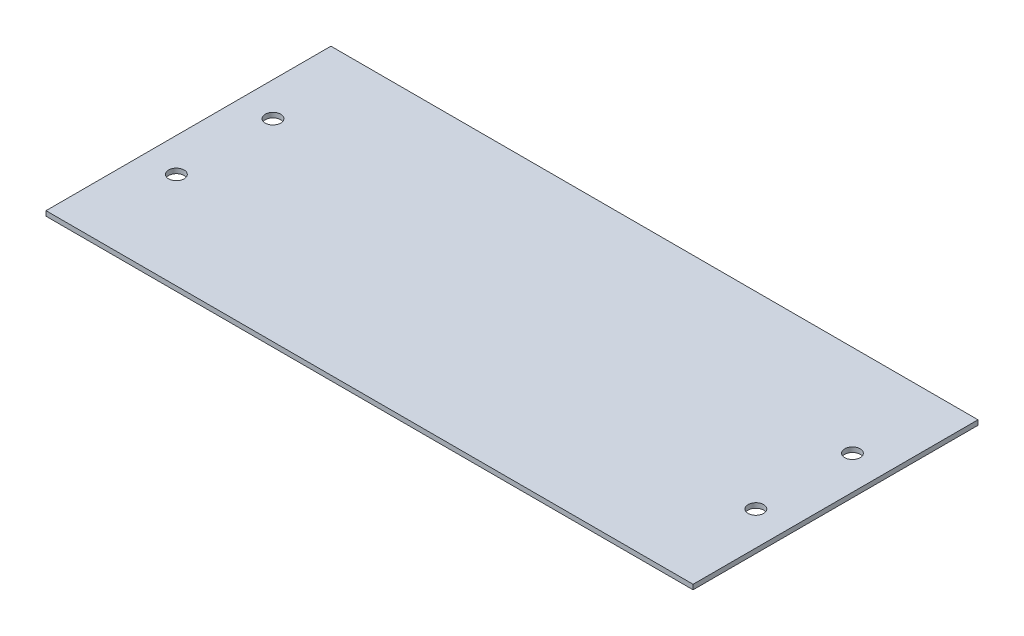
ISO-10303-21;
HEADER;
FILE_DESCRIPTION(('STEP AP214'),'2;1');
FILE_NAME('part.step','',(''),(''),'','','');
FILE_SCHEMA(('AUTOMOTIVE_DESIGN { 1 0 10303 214 1 1 1 1 }'));
ENDSEC;
DATA;
#1=APPLICATION_CONTEXT('core data for automotive mechanical design processes');
#2=APPLICATION_PROTOCOL_DEFINITION('international standard','automotive_design',2000,#1);
#3=PRODUCT_CONTEXT('',#1,'mechanical');
#4=PRODUCT('Part','Part','',(#3));
#5=PRODUCT_RELATED_PRODUCT_CATEGORY('part','',(#4));
#6=PRODUCT_DEFINITION_FORMATION('','',#4);
#7=PRODUCT_DEFINITION_CONTEXT('part definition',#1,'design');
#8=PRODUCT_DEFINITION('design','',#6,#7);
#9=PRODUCT_DEFINITION_SHAPE('','',#8);
#10=(LENGTH_UNIT() NAMED_UNIT(*) SI_UNIT(.MILLI.,.METRE.));
#11=(NAMED_UNIT(*) PLANE_ANGLE_UNIT() SI_UNIT($,.RADIAN.));
#12=(NAMED_UNIT(*) SI_UNIT($,.STERADIAN.) SOLID_ANGLE_UNIT());
#13=UNCERTAINTY_MEASURE_WITH_UNIT(LENGTH_MEASURE(1.E-05),#10,'distance_accuracy_value','');
#14=(GEOMETRIC_REPRESENTATION_CONTEXT(3) GLOBAL_UNCERTAINTY_ASSIGNED_CONTEXT((#13)) GLOBAL_UNIT_ASSIGNED_CONTEXT((#10,
#11,#12)) REPRESENTATION_CONTEXT('',''));
#15=CARTESIAN_POINT('',(0.,0.,0.));
#16=DIRECTION('',(0.,0.,1.));
#17=DIRECTION('',(1.,0.,0.));
#18=AXIS2_PLACEMENT_3D('',#15,#16,#17);
#19=CARTESIAN_POINT('',(-67.,1.,29.5));
#20=DIRECTION('',(1.,0.,0.));
#21=DIRECTION('',(0.,0.,-1.));
#22=AXIS2_PLACEMENT_3D('',#19,#20,#21);
#23=PLANE('',#22);
#24=DIRECTION('',(0.,0.,1.));
#25=VECTOR('',#24,1.);
#26=CARTESIAN_POINT('',(-67.,0.,29.5));
#27=LINE('',#26,#25);
#28=CARTESIAN_POINT('',(-67.,0.,-29.5));
#29=VERTEX_POINT('',#28);
#30=CARTESIAN_POINT('',(-67.,0.,29.5));
#31=VERTEX_POINT('',#30);
#32=EDGE_CURVE('E97',#29,#31,#27,.T.);
#33=ORIENTED_EDGE('',*,*,#32,.T.);
#34=DIRECTION('',(0.,-1.,0.));
#35=VECTOR('',#34,1.);
#36=CARTESIAN_POINT('',(-67.,1.,29.5));
#37=LINE('',#36,#35);
#38=CARTESIAN_POINT('',(-67.,1.,29.5));
#39=VERTEX_POINT('',#38);
#40=EDGE_CURVE('E11',#39,#31,#37,.T.);
#41=ORIENTED_EDGE('',*,*,#40,.F.);
#42=DIRECTION('',(0.,0.,1.));
#43=VECTOR('',#42,1.);
#44=CARTESIAN_POINT('',(-67.,1.,29.5));
#45=LINE('',#44,#43);
#46=CARTESIAN_POINT('',(-67.,1.,-29.5));
#47=VERTEX_POINT('',#46);
#48=EDGE_CURVE('E85',#47,#39,#45,.T.);
#49=ORIENTED_EDGE('',*,*,#48,.F.);
#50=DIRECTION('',(0.,-1.,0.));
#51=VECTOR('',#50,1.);
#52=CARTESIAN_POINT('',(-67.,1.,-29.5));
#53=LINE('',#52,#51);
#54=EDGE_CURVE('E93',#47,#29,#53,.T.);
#55=ORIENTED_EDGE('',*,*,#54,.T.);
#56=EDGE_LOOP('',(#33,#41,#49,#55));
#57=FACE_BOUND('',#56,.T.);
#58=ADVANCED_FACE('F34',(#57),#23,.F.);
#59=CARTESIAN_POINT('',(67.,1.,29.5));
#60=DIRECTION('',(0.,0.,-1.));
#61=DIRECTION('',(-1.,0.,0.));
#62=AXIS2_PLACEMENT_3D('',#59,#60,#61);
#63=PLANE('',#62);
#64=DIRECTION('',(1.,0.,0.));
#65=VECTOR('',#64,1.);
#66=CARTESIAN_POINT('',(67.,0.,29.5));
#67=LINE('',#66,#65);
#68=CARTESIAN_POINT('',(67.,0.,29.5));
#69=VERTEX_POINT('',#68);
#70=EDGE_CURVE('E89',#31,#69,#67,.T.);
#71=ORIENTED_EDGE('',*,*,#70,.T.);
#72=DIRECTION('',(0.,-1.,0.));
#73=VECTOR('',#72,1.);
#74=CARTESIAN_POINT('',(67.,1.,29.5));
#75=LINE('',#74,#73);
#76=CARTESIAN_POINT('',(67.,1.,29.5));
#77=VERTEX_POINT('',#76);
#78=EDGE_CURVE('E42',#77,#69,#75,.T.);
#79=ORIENTED_EDGE('',*,*,#78,.F.);
#80=DIRECTION('',(1.,0.,0.));
#81=VECTOR('',#80,1.);
#82=CARTESIAN_POINT('',(67.,1.,29.5));
#83=LINE('',#82,#81);
#84=EDGE_CURVE('E80',#39,#77,#83,.T.);
#85=ORIENTED_EDGE('',*,*,#84,.F.);
#86=ORIENTED_EDGE('',*,*,#40,.T.);
#87=EDGE_LOOP('',(#71,#79,#85,#86));
#88=FACE_BOUND('',#87,.T.);
#89=ADVANCED_FACE('F88',(#88),#63,.F.);
#90=CARTESIAN_POINT('',(67.,1.,29.5));
#91=DIRECTION('',(-1.,0.,0.));
#92=DIRECTION('',(0.,0.,1.));
#93=AXIS2_PLACEMENT_3D('',#90,#91,#92);
#94=PLANE('',#93);
#95=DIRECTION('',(0.,0.,-1.));
#96=VECTOR('',#95,1.);
#97=CARTESIAN_POINT('',(67.,0.,29.5));
#98=LINE('',#97,#96);
#99=CARTESIAN_POINT('',(67.,0.,-29.5));
#100=VERTEX_POINT('',#99);
#101=EDGE_CURVE('E67',#69,#100,#98,.T.);
#102=ORIENTED_EDGE('',*,*,#101,.T.);
#103=DIRECTION('',(0.,-1.,0.));
#104=VECTOR('',#103,1.);
#105=CARTESIAN_POINT('',(67.,1.,-29.5));
#106=LINE('',#105,#104);
#107=CARTESIAN_POINT('',(67.,1.,-29.5));
#108=VERTEX_POINT('',#107);
#109=EDGE_CURVE('E90',#108,#100,#106,.T.);
#110=ORIENTED_EDGE('',*,*,#109,.F.);
#111=DIRECTION('',(0.,0.,-1.));
#112=VECTOR('',#111,1.);
#113=CARTESIAN_POINT('',(67.,1.,29.5));
#114=LINE('',#113,#112);
#115=EDGE_CURVE('E83',#77,#108,#114,.T.);
#116=ORIENTED_EDGE('',*,*,#115,.F.);
#117=ORIENTED_EDGE('',*,*,#78,.T.);
#118=EDGE_LOOP('',(#102,#110,#116,#117));
#119=FACE_BOUND('',#118,.T.);
#120=ADVANCED_FACE('F91',(#119),#94,.F.);
#121=CARTESIAN_POINT('',(67.,1.,-29.5));
#122=DIRECTION('',(0.,0.,1.));
#123=DIRECTION('',(1.,0.,0.));
#124=AXIS2_PLACEMENT_3D('',#121,#122,#123);
#125=PLANE('',#124);
#126=DIRECTION('',(-1.,0.,0.));
#127=VECTOR('',#126,1.);
#128=CARTESIAN_POINT('',(67.,0.,-29.5));
#129=LINE('',#128,#127);
#130=EDGE_CURVE('E73',#100,#29,#129,.T.);
#131=ORIENTED_EDGE('',*,*,#130,.T.);
#132=ORIENTED_EDGE('',*,*,#54,.F.);
#133=DIRECTION('',(-1.,0.,0.));
#134=VECTOR('',#133,1.);
#135=CARTESIAN_POINT('',(67.,1.,-29.5));
#136=LINE('',#135,#134);
#137=EDGE_CURVE('E50',#108,#47,#136,.T.);
#138=ORIENTED_EDGE('',*,*,#137,.F.);
#139=ORIENTED_EDGE('',*,*,#109,.T.);
#140=EDGE_LOOP('',(#131,#132,#138,#139));
#141=FACE_BOUND('',#140,.T.);
#142=ADVANCED_FACE('F105',(#141),#125,.F.);
#143=CARTESIAN_POINT('',(0.,1.,0.));
#144=DIRECTION('',(0.,1.,0.));
#145=DIRECTION('',(0.,0.,1.));
#146=AXIS2_PLACEMENT_3D('',#143,#144,#145);
#147=PLANE('',#146);
#148=CARTESIAN_POINT('',(60.,1.,9.49999999999999));
#149=DIRECTION('',(0.,1.,0.));
#150=DIRECTION('',(0.,0.,-1.));
#151=AXIS2_PLACEMENT_3D('',#148,#149,#150);
#152=CIRCLE('',#151,1.6);
#153=CARTESIAN_POINT('',(60.,1.,7.9));
#154=VERTEX_POINT('',#153);
#155=EDGE_CURVE('E117',#154,#154,#152,.T.);
#156=ORIENTED_EDGE('',*,*,#155,.F.);
#157=EDGE_LOOP('',(#156));
#158=FACE_BOUND('',#157,.T.);
#159=CARTESIAN_POINT('',(60.,1.,-10.5));
#160=DIRECTION('',(0.,1.,0.));
#161=DIRECTION('',(0.,0.,-1.));
#162=AXIS2_PLACEMENT_3D('',#159,#160,#161);
#163=CIRCLE('',#162,1.6);
#164=CARTESIAN_POINT('',(60.,1.,-12.1));
#165=VERTEX_POINT('',#164);
#166=EDGE_CURVE('E123',#165,#165,#163,.T.);
#167=ORIENTED_EDGE('',*,*,#166,.F.);
#168=EDGE_LOOP('',(#167));
#169=FACE_BOUND('',#168,.T.);
#170=CARTESIAN_POINT('',(-60.,1.,-10.5));
#171=DIRECTION('',(0.,1.,0.));
#172=DIRECTION('',(0.,0.,1.));
#173=AXIS2_PLACEMENT_3D('',#170,#171,#172);
#174=CIRCLE('',#173,1.6);
#175=CARTESIAN_POINT('',(-60.,1.,-8.9));
#176=VERTEX_POINT('',#175);
#177=EDGE_CURVE('E129',#176,#176,#174,.T.);
#178=ORIENTED_EDGE('',*,*,#177,.F.);
#179=EDGE_LOOP('',(#178));
#180=FACE_BOUND('',#179,.T.);
#181=CARTESIAN_POINT('',(-60.,1.,9.50000000000001));
#182=DIRECTION('',(0.,1.,0.));
#183=DIRECTION('',(0.,0.,1.));
#184=AXIS2_PLACEMENT_3D('',#181,#182,#183);
#185=CIRCLE('',#184,1.6);
#186=CARTESIAN_POINT('',(-60.,1.,11.1));
#187=VERTEX_POINT('',#186);
#188=EDGE_CURVE('E111',#187,#187,#185,.T.);
#189=ORIENTED_EDGE('',*,*,#188,.F.);
#190=EDGE_LOOP('',(#189));
#191=FACE_BOUND('',#190,.T.);
#192=ORIENTED_EDGE('',*,*,#48,.T.);
#193=ORIENTED_EDGE('',*,*,#84,.T.);
#194=ORIENTED_EDGE('',*,*,#115,.T.);
#195=ORIENTED_EDGE('',*,*,#137,.T.);
#196=EDGE_LOOP('',(#192,#193,#194,#195));
#197=FACE_BOUND('',#196,.T.);
#198=ADVANCED_FACE('F81',(#158,#169,#180,#191,#197),#147,.T.);
#199=CARTESIAN_POINT('',(0.,0.,0.));
#200=DIRECTION('',(0.,1.,0.));
#201=DIRECTION('',(0.,0.,1.));
#202=AXIS2_PLACEMENT_3D('',#199,#200,#201);
#203=PLANE('',#202);
#204=CARTESIAN_POINT('',(60.,0.,9.49999999999999));
#205=DIRECTION('',(0.,1.,0.));
#206=DIRECTION('',(0.,0.,-1.));
#207=AXIS2_PLACEMENT_3D('',#204,#205,#206);
#208=CIRCLE('',#207,1.6);
#209=CARTESIAN_POINT('',(60.,0.,7.9));
#210=VERTEX_POINT('',#209);
#211=EDGE_CURVE('E120',#210,#210,#208,.T.);
#212=ORIENTED_EDGE('',*,*,#211,.T.);
#213=EDGE_LOOP('',(#212));
#214=FACE_BOUND('',#213,.T.);
#215=CARTESIAN_POINT('',(60.,0.,-10.5));
#216=DIRECTION('',(0.,1.,0.));
#217=DIRECTION('',(0.,0.,-1.));
#218=AXIS2_PLACEMENT_3D('',#215,#216,#217);
#219=CIRCLE('',#218,1.6);
#220=CARTESIAN_POINT('',(60.,0.,-12.1));
#221=VERTEX_POINT('',#220);
#222=EDGE_CURVE('E126',#221,#221,#219,.T.);
#223=ORIENTED_EDGE('',*,*,#222,.T.);
#224=EDGE_LOOP('',(#223));
#225=FACE_BOUND('',#224,.T.);
#226=CARTESIAN_POINT('',(-60.,0.,-10.5));
#227=DIRECTION('',(0.,1.,0.));
#228=DIRECTION('',(0.,0.,1.));
#229=AXIS2_PLACEMENT_3D('',#226,#227,#228);
#230=CIRCLE('',#229,1.6);
#231=CARTESIAN_POINT('',(-60.,0.,-8.9));
#232=VERTEX_POINT('',#231);
#233=EDGE_CURVE('E114',#232,#232,#230,.T.);
#234=ORIENTED_EDGE('',*,*,#233,.T.);
#235=EDGE_LOOP('',(#234));
#236=FACE_BOUND('',#235,.T.);
#237=CARTESIAN_POINT('',(-60.,0.,9.50000000000001));
#238=DIRECTION('',(0.,1.,0.));
#239=DIRECTION('',(0.,0.,1.));
#240=AXIS2_PLACEMENT_3D('',#237,#238,#239);
#241=CIRCLE('',#240,1.6);
#242=CARTESIAN_POINT('',(-60.,0.,11.1));
#243=VERTEX_POINT('',#242);
#244=EDGE_CURVE('E100',#243,#243,#241,.T.);
#245=ORIENTED_EDGE('',*,*,#244,.T.);
#246=EDGE_LOOP('',(#245));
#247=FACE_BOUND('',#246,.T.);
#248=ORIENTED_EDGE('',*,*,#32,.F.);
#249=ORIENTED_EDGE('',*,*,#130,.F.);
#250=ORIENTED_EDGE('',*,*,#101,.F.);
#251=ORIENTED_EDGE('',*,*,#70,.F.);
#252=EDGE_LOOP('',(#248,#249,#250,#251));
#253=FACE_BOUND('',#252,.T.);
#254=ADVANCED_FACE('F108',(#214,#225,#236,#247,#253),#203,.F.);
#255=CARTESIAN_POINT('',(-60.,0.,9.50000000000001));
#256=DIRECTION('',(0.,1.,0.));
#257=DIRECTION('',(0.,0.,1.));
#258=AXIS2_PLACEMENT_3D('',#255,#256,#257);
#259=CYLINDRICAL_SURFACE('',#258,1.6);
#260=ORIENTED_EDGE('',*,*,#244,.F.);
#261=EDGE_LOOP('',(#260));
#262=FACE_BOUND('',#261,.T.);
#263=ORIENTED_EDGE('',*,*,#188,.T.);
#264=EDGE_LOOP('',(#263));
#265=FACE_BOUND('',#264,.T.);
#266=ADVANCED_FACE('F141',(#262,#265),#259,.F.);
#267=CARTESIAN_POINT('',(-60.,0.,-10.5));
#268=DIRECTION('',(0.,1.,0.));
#269=DIRECTION('',(0.,0.,1.));
#270=AXIS2_PLACEMENT_3D('',#267,#268,#269);
#271=CYLINDRICAL_SURFACE('',#270,1.6);
#272=ORIENTED_EDGE('',*,*,#233,.F.);
#273=EDGE_LOOP('',(#272));
#274=FACE_BOUND('',#273,.T.);
#275=ORIENTED_EDGE('',*,*,#177,.T.);
#276=EDGE_LOOP('',(#275));
#277=FACE_BOUND('',#276,.T.);
#278=ADVANCED_FACE('F137',(#274,#277),#271,.F.);
#279=CARTESIAN_POINT('',(60.,0.,-10.5));
#280=DIRECTION('',(0.,1.,0.));
#281=DIRECTION('',(0.,0.,1.));
#282=AXIS2_PLACEMENT_3D('',#279,#280,#281);
#283=CYLINDRICAL_SURFACE('',#282,1.6);
#284=ORIENTED_EDGE('',*,*,#222,.F.);
#285=EDGE_LOOP('',(#284));
#286=FACE_BOUND('',#285,.T.);
#287=ORIENTED_EDGE('',*,*,#166,.T.);
#288=EDGE_LOOP('',(#287));
#289=FACE_BOUND('',#288,.T.);
#290=ADVANCED_FACE('F140',(#286,#289),#283,.F.);
#291=CARTESIAN_POINT('',(60.,0.,9.49999999999999));
#292=DIRECTION('',(0.,1.,0.));
#293=DIRECTION('',(0.,0.,1.));
#294=AXIS2_PLACEMENT_3D('',#291,#292,#293);
#295=CYLINDRICAL_SURFACE('',#294,1.6);
#296=ORIENTED_EDGE('',*,*,#211,.F.);
#297=EDGE_LOOP('',(#296));
#298=FACE_BOUND('',#297,.T.);
#299=ORIENTED_EDGE('',*,*,#155,.T.);
#300=EDGE_LOOP('',(#299));
#301=FACE_BOUND('',#300,.T.);
#302=ADVANCED_FACE('F202',(#298,#301),#295,.F.);
#303=CLOSED_SHELL('',(#58,#89,#120,#142,#198,#254,#266,#278,#290,#302));
#304=MANIFOLD_SOLID_BREP('B2',#303);
#305=ADVANCED_BREP_SHAPE_REPRESENTATION('',(#18,#304),#14);
#306=SHAPE_DEFINITION_REPRESENTATION(#9,#305);
ENDSEC;
END-ISO-10303-21;
